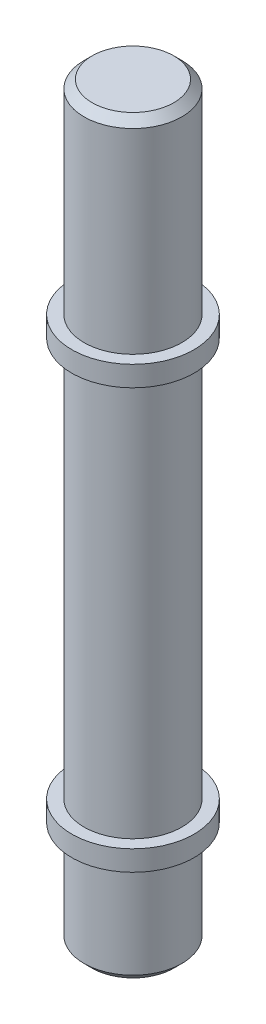
ISO-10303-21;
HEADER;
FILE_DESCRIPTION(('STEP AP214'),'2;1');
FILE_NAME('part.step','',(''),(''),'','','');
FILE_SCHEMA(('AUTOMOTIVE_DESIGN { 1 0 10303 214 1 1 1 1 }'));
ENDSEC;
DATA;
#1=APPLICATION_CONTEXT('core data for automotive mechanical design processes');
#2=APPLICATION_PROTOCOL_DEFINITION('international standard','automotive_design',2000,#1);
#3=PRODUCT_CONTEXT('',#1,'mechanical');
#4=PRODUCT('Part','Part','',(#3));
#5=PRODUCT_RELATED_PRODUCT_CATEGORY('part','',(#4));
#6=PRODUCT_DEFINITION_FORMATION('','',#4);
#7=PRODUCT_DEFINITION_CONTEXT('part definition',#1,'design');
#8=PRODUCT_DEFINITION('design','',#6,#7);
#9=PRODUCT_DEFINITION_SHAPE('','',#8);
#10=(LENGTH_UNIT() NAMED_UNIT(*) SI_UNIT(.MILLI.,.METRE.));
#11=(NAMED_UNIT(*) PLANE_ANGLE_UNIT() SI_UNIT($,.RADIAN.));
#12=(NAMED_UNIT(*) SI_UNIT($,.STERADIAN.) SOLID_ANGLE_UNIT());
#13=UNCERTAINTY_MEASURE_WITH_UNIT(LENGTH_MEASURE(1.E-05),#10,'distance_accuracy_value','');
#14=(GEOMETRIC_REPRESENTATION_CONTEXT(3) GLOBAL_UNCERTAINTY_ASSIGNED_CONTEXT((#13)) GLOBAL_UNIT_ASSIGNED_CONTEXT((#10,
#11,#12)) REPRESENTATION_CONTEXT('',''));
#15=CARTESIAN_POINT('',(0.,0.,0.));
#16=DIRECTION('',(0.,0.,1.));
#17=DIRECTION('',(1.,0.,0.));
#18=AXIS2_PLACEMENT_3D('',#15,#16,#17);
#19=CARTESIAN_POINT('',(0.,-88.3005410788862,0.));
#20=DIRECTION('',(0.,1.,0.));
#21=DIRECTION('',(-1.,0.,0.));
#22=AXIS2_PLACEMENT_3D('',#19,#20,#21);
#23=PLANE('',#22);
#24=CARTESIAN_POINT('',(0.,-88.3005410788862,0.));
#25=DIRECTION('',(0.,1.,0.));
#26=DIRECTION('',(-1.,0.,0.));
#27=AXIS2_PLACEMENT_3D('',#24,#25,#26);
#28=CIRCLE('',#27,9.99999999999999);
#29=CARTESIAN_POINT('',(-9.99999999999999,-88.3005410788862,0.));
#30=VERTEX_POINT('',#29);
#31=EDGE_CURVE('E57',#30,#30,#28,.F.);
#32=ORIENTED_EDGE('',*,*,#31,.T.);
#33=EDGE_LOOP('',(#32));
#34=FACE_BOUND('',#33,.T.);
#35=ADVANCED_FACE('F45',(#34),#23,.F.);
#36=CARTESIAN_POINT('',(0.,95.6994589211138,0.));
#37=DIRECTION('',(0.,1.,0.));
#38=DIRECTION('',(-1.,0.,0.));
#39=AXIS2_PLACEMENT_3D('',#36,#37,#38);
#40=CYLINDRICAL_SURFACE('',#39,12.);
#41=CARTESIAN_POINT('',(0.,-86.3005410788862,0.));
#42=DIRECTION('',(0.,1.,0.));
#43=DIRECTION('',(-1.,0.,0.));
#44=AXIS2_PLACEMENT_3D('',#41,#42,#43);
#45=CIRCLE('',#44,12.);
#46=CARTESIAN_POINT('',(-12.,-86.3005410788862,0.));
#47=VERTEX_POINT('',#46);
#48=EDGE_CURVE('E61',#47,#47,#45,.T.);
#49=ORIENTED_EDGE('',*,*,#48,.T.);
#50=EDGE_LOOP('',(#49));
#51=FACE_BOUND('',#50,.T.);
#52=CARTESIAN_POINT('',(0.,-62.3005410788862,0.));
#53=DIRECTION('',(0.,1.,0.));
#54=DIRECTION('',(-1.,0.,0.));
#55=AXIS2_PLACEMENT_3D('',#52,#53,#54);
#56=CIRCLE('',#55,12.);
#57=CARTESIAN_POINT('',(-12.,-62.3005410788862,0.));
#58=VERTEX_POINT('',#57);
#59=EDGE_CURVE('E66',#58,#58,#56,.T.);
#60=ORIENTED_EDGE('',*,*,#59,.F.);
#61=EDGE_LOOP('',(#60));
#62=FACE_BOUND('',#61,.T.);
#63=ADVANCED_FACE('F132',(#51,#62),#40,.T.);
#64=CARTESIAN_POINT('',(12.,-62.3005410788862,0.));
#65=DIRECTION('',(0.,1.,0.));
#66=DIRECTION('',(-1.,0.,0.));
#67=AXIS2_PLACEMENT_3D('',#64,#65,#66);
#68=PLANE('',#67);
#69=CARTESIAN_POINT('',(0.,-62.3005410788862,0.));
#70=DIRECTION('',(0.,1.,0.));
#71=DIRECTION('',(-1.,0.,0.));
#72=AXIS2_PLACEMENT_3D('',#69,#70,#71);
#73=CIRCLE('',#72,15.);
#74=CARTESIAN_POINT('',(-15.,-62.3005410788862,0.));
#75=VERTEX_POINT('',#74);
#76=EDGE_CURVE('E69',#75,#75,#73,.T.);
#77=ORIENTED_EDGE('',*,*,#76,.F.);
#78=EDGE_LOOP('',(#77));
#79=FACE_BOUND('',#78,.T.);
#80=ORIENTED_EDGE('',*,*,#59,.T.);
#81=EDGE_LOOP('',(#80));
#82=FACE_BOUND('',#81,.T.);
#83=ADVANCED_FACE('F126',(#79,#82),#68,.F.);
#84=CARTESIAN_POINT('',(0.,95.6994589211138,0.));
#85=DIRECTION('',(0.,1.,0.));
#86=DIRECTION('',(-1.,0.,0.));
#87=AXIS2_PLACEMENT_3D('',#84,#85,#86);
#88=CYLINDRICAL_SURFACE('',#87,15.);
#89=CARTESIAN_POINT('',(0.,-57.3005410788862,0.));
#90=DIRECTION('',(0.,1.,0.));
#91=DIRECTION('',(-1.,0.,0.));
#92=AXIS2_PLACEMENT_3D('',#89,#90,#91);
#93=CIRCLE('',#92,15.);
#94=CARTESIAN_POINT('',(-15.,-57.3005410788862,0.));
#95=VERTEX_POINT('',#94);
#96=EDGE_CURVE('E72',#95,#95,#93,.T.);
#97=ORIENTED_EDGE('',*,*,#96,.F.);
#98=EDGE_LOOP('',(#97));
#99=FACE_BOUND('',#98,.T.);
#100=ORIENTED_EDGE('',*,*,#76,.T.);
#101=EDGE_LOOP('',(#100));
#102=FACE_BOUND('',#101,.T.);
#103=ADVANCED_FACE('F120',(#99,#102),#88,.T.);
#104=CARTESIAN_POINT('',(15.,-57.3005410788862,0.));
#105=DIRECTION('',(0.,-1.,0.));
#106=DIRECTION('',(1.,0.,0.));
#107=AXIS2_PLACEMENT_3D('',#104,#105,#106);
#108=PLANE('',#107);
#109=CARTESIAN_POINT('',(0.,-57.3005410788862,0.));
#110=DIRECTION('',(0.,1.,0.));
#111=DIRECTION('',(-1.,0.,0.));
#112=AXIS2_PLACEMENT_3D('',#109,#110,#111);
#113=CIRCLE('',#112,12.);
#114=CARTESIAN_POINT('',(-12.,-57.3005410788862,0.));
#115=VERTEX_POINT('',#114);
#116=EDGE_CURVE('E75',#115,#115,#113,.T.);
#117=ORIENTED_EDGE('',*,*,#116,.F.);
#118=EDGE_LOOP('',(#117));
#119=FACE_BOUND('',#118,.T.);
#120=ORIENTED_EDGE('',*,*,#96,.T.);
#121=EDGE_LOOP('',(#120));
#122=FACE_BOUND('',#121,.T.);
#123=ADVANCED_FACE('F114',(#119,#122),#108,.F.);
#124=CARTESIAN_POINT('',(0.,95.6994589211138,0.));
#125=DIRECTION('',(0.,1.,0.));
#126=DIRECTION('',(-1.,0.,0.));
#127=AXIS2_PLACEMENT_3D('',#124,#125,#126);
#128=CYLINDRICAL_SURFACE('',#127,12.);
#129=CARTESIAN_POINT('',(0.,40.6994589211138,0.));
#130=DIRECTION('',(0.,1.,0.));
#131=DIRECTION('',(-1.,0.,0.));
#132=AXIS2_PLACEMENT_3D('',#129,#130,#131);
#133=CIRCLE('',#132,12.);
#134=CARTESIAN_POINT('',(-12.,40.6994589211138,0.));
#135=VERTEX_POINT('',#134);
#136=EDGE_CURVE('E78',#135,#135,#133,.T.);
#137=ORIENTED_EDGE('',*,*,#136,.F.);
#138=EDGE_LOOP('',(#137));
#139=FACE_BOUND('',#138,.T.);
#140=ORIENTED_EDGE('',*,*,#116,.T.);
#141=EDGE_LOOP('',(#140));
#142=FACE_BOUND('',#141,.T.);
#143=ADVANCED_FACE('F108',(#139,#142),#128,.T.);
#144=CARTESIAN_POINT('',(12.,40.6994589211138,0.));
#145=DIRECTION('',(0.,1.,0.));
#146=DIRECTION('',(-1.,0.,0.));
#147=AXIS2_PLACEMENT_3D('',#144,#145,#146);
#148=PLANE('',#147);
#149=CARTESIAN_POINT('',(0.,40.6994589211138,0.));
#150=DIRECTION('',(0.,1.,0.));
#151=DIRECTION('',(-1.,0.,0.));
#152=AXIS2_PLACEMENT_3D('',#149,#150,#151);
#153=CIRCLE('',#152,15.);
#154=CARTESIAN_POINT('',(-15.,40.6994589211138,0.));
#155=VERTEX_POINT('',#154);
#156=EDGE_CURVE('E81',#155,#155,#153,.T.);
#157=ORIENTED_EDGE('',*,*,#156,.F.);
#158=EDGE_LOOP('',(#157));
#159=FACE_BOUND('',#158,.T.);
#160=ORIENTED_EDGE('',*,*,#136,.T.);
#161=EDGE_LOOP('',(#160));
#162=FACE_BOUND('',#161,.T.);
#163=ADVANCED_FACE('F102',(#159,#162),#148,.F.);
#164=CARTESIAN_POINT('',(0.,95.6994589211138,0.));
#165=DIRECTION('',(0.,1.,0.));
#166=DIRECTION('',(-1.,0.,0.));
#167=AXIS2_PLACEMENT_3D('',#164,#165,#166);
#168=CYLINDRICAL_SURFACE('',#167,15.);
#169=CARTESIAN_POINT('',(0.,45.6994589211138,0.));
#170=DIRECTION('',(0.,1.,0.));
#171=DIRECTION('',(-1.,0.,0.));
#172=AXIS2_PLACEMENT_3D('',#169,#170,#171);
#173=CIRCLE('',#172,15.);
#174=CARTESIAN_POINT('',(-15.,45.6994589211138,0.));
#175=VERTEX_POINT('',#174);
#176=EDGE_CURVE('E84',#175,#175,#173,.T.);
#177=ORIENTED_EDGE('',*,*,#176,.F.);
#178=EDGE_LOOP('',(#177));
#179=FACE_BOUND('',#178,.T.);
#180=ORIENTED_EDGE('',*,*,#156,.T.);
#181=EDGE_LOOP('',(#180));
#182=FACE_BOUND('',#181,.T.);
#183=ADVANCED_FACE('F96',(#179,#182),#168,.T.);
#184=CARTESIAN_POINT('',(15.,45.6994589211138,0.));
#185=DIRECTION('',(0.,-1.,0.));
#186=DIRECTION('',(1.,0.,0.));
#187=AXIS2_PLACEMENT_3D('',#184,#185,#186);
#188=PLANE('',#187);
#189=CARTESIAN_POINT('',(0.,45.6994589211138,0.));
#190=DIRECTION('',(0.,1.,0.));
#191=DIRECTION('',(-1.,0.,0.));
#192=AXIS2_PLACEMENT_3D('',#189,#190,#191);
#193=CIRCLE('',#192,12.);
#194=CARTESIAN_POINT('',(-12.,45.6994589211138,0.));
#195=VERTEX_POINT('',#194);
#196=EDGE_CURVE('E87',#195,#195,#193,.T.);
#197=ORIENTED_EDGE('',*,*,#196,.F.);
#198=EDGE_LOOP('',(#197));
#199=FACE_BOUND('',#198,.T.);
#200=ORIENTED_EDGE('',*,*,#176,.T.);
#201=EDGE_LOOP('',(#200));
#202=FACE_BOUND('',#201,.T.);
#203=ADVANCED_FACE('F93',(#199,#202),#188,.F.);
#204=CARTESIAN_POINT('',(0.,95.6994589211138,0.));
#205=DIRECTION('',(0.,1.,0.));
#206=DIRECTION('',(-1.,0.,0.));
#207=AXIS2_PLACEMENT_3D('',#204,#205,#206);
#208=CYLINDRICAL_SURFACE('',#207,12.);
#209=CARTESIAN_POINT('',(0.,93.6994589211138,0.));
#210=DIRECTION('',(0.,-1.,0.));
#211=DIRECTION('',(1.,0.,0.));
#212=AXIS2_PLACEMENT_3D('',#209,#210,#211);
#213=CIRCLE('',#212,12.);
#214=CARTESIAN_POINT('',(12.,93.6994589211138,0.));
#215=VERTEX_POINT('',#214);
#216=EDGE_CURVE('E10',#215,#215,#213,.T.);
#217=ORIENTED_EDGE('',*,*,#216,.T.);
#218=EDGE_LOOP('',(#217));
#219=FACE_BOUND('',#218,.T.);
#220=ORIENTED_EDGE('',*,*,#196,.T.);
#221=EDGE_LOOP('',(#220));
#222=FACE_BOUND('',#221,.T.);
#223=ADVANCED_FACE('F91',(#219,#222),#208,.T.);
#224=CARTESIAN_POINT('',(12.,95.6994589211138,0.));
#225=DIRECTION('',(0.,-1.,0.));
#226=DIRECTION('',(1.,0.,0.));
#227=AXIS2_PLACEMENT_3D('',#224,#225,#226);
#228=PLANE('',#227);
#229=CARTESIAN_POINT('',(0.,95.6994589211138,0.));
#230=DIRECTION('',(0.,-1.,0.));
#231=DIRECTION('',(1.,0.,0.));
#232=AXIS2_PLACEMENT_3D('',#229,#230,#231);
#233=CIRCLE('',#232,10.0000000000001);
#234=CARTESIAN_POINT('',(10.0000000000001,95.6994589211138,0.));
#235=VERTEX_POINT('',#234);
#236=EDGE_CURVE('E53',#235,#235,#233,.F.);
#237=ORIENTED_EDGE('',*,*,#236,.T.);
#238=EDGE_LOOP('',(#237));
#239=FACE_BOUND('',#238,.T.);
#240=ADVANCED_FACE('F149',(#239),#228,.F.);
#241=CARTESIAN_POINT('',(0.,-86.3005410788862,0.));
#242=DIRECTION('',(0.,1.,0.));
#243=DIRECTION('',(-1.,0.,0.));
#244=AXIS2_PLACEMENT_3D('',#241,#242,#243);
#245=CONICAL_SURFACE('',#244,12.,0.785398163397454);
#246=ORIENTED_EDGE('',*,*,#31,.F.);
#247=EDGE_LOOP('',(#246));
#248=FACE_BOUND('',#247,.T.);
#249=ORIENTED_EDGE('',*,*,#48,.F.);
#250=EDGE_LOOP('',(#249));
#251=FACE_BOUND('',#250,.T.);
#252=ADVANCED_FACE('F145',(#248,#251),#245,.T.);
#253=CARTESIAN_POINT('',(0.,95.6994589211138,0.));
#254=DIRECTION('',(0.,-1.,0.));
#255=DIRECTION('',(1.,0.,0.));
#256=AXIS2_PLACEMENT_3D('',#253,#254,#255);
#257=CONICAL_SURFACE('',#256,10.0000000000001,0.785398163397444);
#258=ORIENTED_EDGE('',*,*,#216,.F.);
#259=EDGE_LOOP('',(#258));
#260=FACE_BOUND('',#259,.T.);
#261=ORIENTED_EDGE('',*,*,#236,.F.);
#262=EDGE_LOOP('',(#261));
#263=FACE_BOUND('',#262,.T.);
#264=ADVANCED_FACE('F48',(#260,#263),#257,.T.);
#265=CLOSED_SHELL('',(#35,#63,#83,#103,#123,#143,#163,#183,#203,#223,#240,#252,#264));
#266=MANIFOLD_SOLID_BREP('B2',#265);
#267=ADVANCED_BREP_SHAPE_REPRESENTATION('',(#18,#266),#14);
#268=SHAPE_DEFINITION_REPRESENTATION(#9,#267);
ENDSEC;
END-ISO-10303-21;
